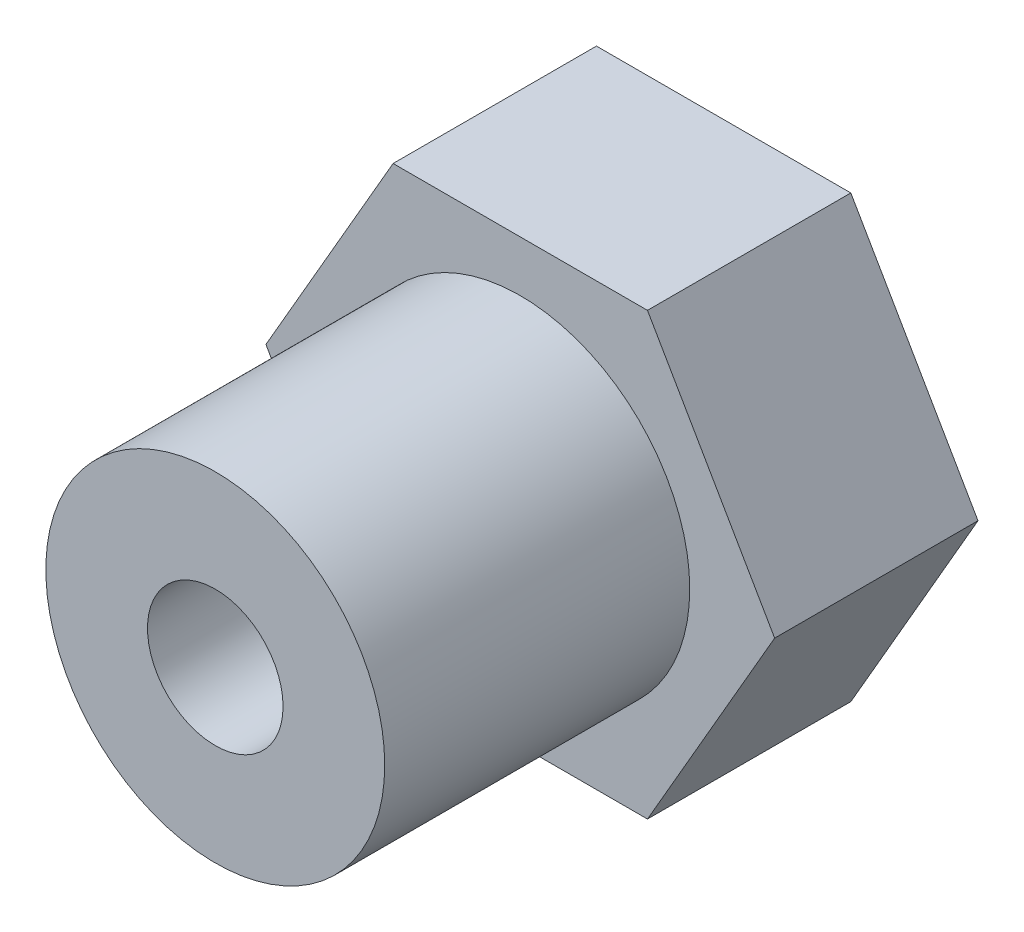
ISO-10303-21;
HEADER;
FILE_DESCRIPTION(('STEP AP214'),'2;1');
FILE_NAME('part.step','',(''),(''),'','','');
FILE_SCHEMA(('AUTOMOTIVE_DESIGN { 1 0 10303 214 1 1 1 1 }'));
ENDSEC;
DATA;
#1=APPLICATION_CONTEXT('core data for automotive mechanical design processes');
#2=APPLICATION_PROTOCOL_DEFINITION('international standard','automotive_design',2000,#1);
#3=PRODUCT_CONTEXT('',#1,'mechanical');
#4=PRODUCT('Part','Part','',(#3));
#5=PRODUCT_RELATED_PRODUCT_CATEGORY('part','',(#4));
#6=PRODUCT_DEFINITION_FORMATION('','',#4);
#7=PRODUCT_DEFINITION_CONTEXT('part definition',#1,'design');
#8=PRODUCT_DEFINITION('design','',#6,#7);
#9=PRODUCT_DEFINITION_SHAPE('','',#8);
#10=(LENGTH_UNIT() NAMED_UNIT(*) SI_UNIT(.MILLI.,.METRE.));
#11=(NAMED_UNIT(*) PLANE_ANGLE_UNIT() SI_UNIT($,.RADIAN.));
#12=(NAMED_UNIT(*) SI_UNIT($,.STERADIAN.) SOLID_ANGLE_UNIT());
#13=UNCERTAINTY_MEASURE_WITH_UNIT(LENGTH_MEASURE(1.E-05),#10,'distance_accuracy_value','');
#14=(GEOMETRIC_REPRESENTATION_CONTEXT(3) GLOBAL_UNCERTAINTY_ASSIGNED_CONTEXT((#13)) GLOBAL_UNIT_ASSIGNED_CONTEXT((#10,
#11,#12)) REPRESENTATION_CONTEXT('',''));
#15=CARTESIAN_POINT('',(0.,0.,0.));
#16=DIRECTION('',(0.,0.,1.));
#17=DIRECTION('',(1.,0.,0.));
#18=AXIS2_PLACEMENT_3D('',#15,#16,#17);
#19=CARTESIAN_POINT('',(0.,-6.5,-6.));
#20=DIRECTION('',(0.,-1.,0.));
#21=DIRECTION('',(1.,0.,0.));
#22=AXIS2_PLACEMENT_3D('',#19,#20,#21);
#23=PLANE('',#22);
#24=DIRECTION('',(1.,0.,0.));
#25=VECTOR('',#24,1.);
#26=CARTESIAN_POINT('',(0.,-6.5,0.));
#27=LINE('',#26,#25);
#28=CARTESIAN_POINT('',(-3.75277674973251,-6.50000000000004,0.));
#29=VERTEX_POINT('',#28);
#30=CARTESIAN_POINT('',(3.75277674973265,-6.49999999999996,0.));
#31=VERTEX_POINT('',#30);
#32=EDGE_CURVE('E127',#29,#31,#27,.T.);
#33=ORIENTED_EDGE('',*,*,#32,.F.);
#34=DIRECTION('',(0.,0.,1.));
#35=VECTOR('',#34,1.);
#36=CARTESIAN_POINT('',(-3.75277674973251,-6.50000000000004,-6.));
#37=LINE('',#36,#35);
#38=CARTESIAN_POINT('',(-3.75277674973251,-6.50000000000004,-6.));
#39=VERTEX_POINT('',#38);
#40=EDGE_CURVE('E45',#39,#29,#37,.T.);
#41=ORIENTED_EDGE('',*,*,#40,.F.);
#42=DIRECTION('',(1.,0.,0.));
#43=VECTOR('',#42,1.);
#44=CARTESIAN_POINT('',(0.,-6.5,-6.));
#45=LINE('',#44,#43);
#46=CARTESIAN_POINT('',(3.75277674973265,-6.49999999999996,-6.));
#47=VERTEX_POINT('',#46);
#48=EDGE_CURVE('E143',#39,#47,#45,.T.);
#49=ORIENTED_EDGE('',*,*,#48,.T.);
#50=DIRECTION('',(0.,0.,1.));
#51=VECTOR('',#50,1.);
#52=CARTESIAN_POINT('',(3.75277674973265,-6.49999999999996,-6.));
#53=LINE('',#52,#51);
#54=EDGE_CURVE('E39',#47,#31,#53,.T.);
#55=ORIENTED_EDGE('',*,*,#54,.T.);
#56=EDGE_LOOP('',(#33,#41,#49,#55));
#57=FACE_BOUND('',#56,.T.);
#58=ADVANCED_FACE('F36',(#57),#23,.T.);
#59=CARTESIAN_POINT('',(-5.62916512459883,-3.25000000000005,-6.));
#60=DIRECTION('',(-0.866025403784435,-0.500000000000007,0.));
#61=DIRECTION('',(0.500000000000007,-0.866025403784434,0.));
#62=AXIS2_PLACEMENT_3D('',#59,#60,#61);
#63=PLANE('',#62);
#64=DIRECTION('',(0.500000000000007,-0.866025403784435,0.));
#65=VECTOR('',#64,1.);
#66=CARTESIAN_POINT('',(-5.62916512459883,-3.25000000000005,0.));
#67=LINE('',#66,#65);
#68=CARTESIAN_POINT('',(-7.50555349946514,0.,0.));
#69=VERTEX_POINT('',#68);
#70=EDGE_CURVE('E140',#69,#29,#67,.T.);
#71=ORIENTED_EDGE('',*,*,#70,.F.);
#72=DIRECTION('',(0.,0.,1.));
#73=VECTOR('',#72,1.);
#74=CARTESIAN_POINT('',(-7.50555349946514,0.,-6.));
#75=LINE('',#74,#73);
#76=CARTESIAN_POINT('',(-7.50555349946514,0.,-6.));
#77=VERTEX_POINT('',#76);
#78=EDGE_CURVE('E76',#77,#69,#75,.T.);
#79=ORIENTED_EDGE('',*,*,#78,.F.);
#80=DIRECTION('',(0.500000000000007,-0.866025403784435,0.));
#81=VECTOR('',#80,1.);
#82=CARTESIAN_POINT('',(-5.62916512459883,-3.25000000000005,-6.));
#83=LINE('',#82,#81);
#84=EDGE_CURVE('E114',#77,#39,#83,.T.);
#85=ORIENTED_EDGE('',*,*,#84,.T.);
#86=ORIENTED_EDGE('',*,*,#40,.T.);
#87=EDGE_LOOP('',(#71,#79,#85,#86));
#88=FACE_BOUND('',#87,.T.);
#89=ADVANCED_FACE('F151',(#88),#63,.T.);
#90=CARTESIAN_POINT('',(-5.62916512459887,3.24999999999997,-6.));
#91=DIRECTION('',(-0.866025403784441,0.499999999999995,0.));
#92=DIRECTION('',(-0.499999999999995,-0.866025403784442,0.));
#93=AXIS2_PLACEMENT_3D('',#90,#91,#92);
#94=PLANE('',#93);
#95=DIRECTION('',(-0.499999999999995,-0.866025403784442,0.));
#96=VECTOR('',#95,1.);
#97=CARTESIAN_POINT('',(-5.62916512459887,3.24999999999997,0.));
#98=LINE('',#97,#96);
#99=CARTESIAN_POINT('',(-3.7527767497326,6.49999999999999,0.));
#100=VERTEX_POINT('',#99);
#101=EDGE_CURVE('E100',#100,#69,#98,.T.);
#102=ORIENTED_EDGE('',*,*,#101,.F.);
#103=DIRECTION('',(0.,0.,1.));
#104=VECTOR('',#103,1.);
#105=CARTESIAN_POINT('',(-3.7527767497326,6.49999999999999,-6.));
#106=LINE('',#105,#104);
#107=CARTESIAN_POINT('',(-3.7527767497326,6.49999999999999,-6.));
#108=VERTEX_POINT('',#107);
#109=EDGE_CURVE('E95',#108,#100,#106,.T.);
#110=ORIENTED_EDGE('',*,*,#109,.F.);
#111=DIRECTION('',(-0.499999999999995,-0.866025403784442,0.));
#112=VECTOR('',#111,1.);
#113=CARTESIAN_POINT('',(-5.62916512459887,3.24999999999997,-6.));
#114=LINE('',#113,#112);
#115=EDGE_CURVE('E98',#108,#77,#114,.T.);
#116=ORIENTED_EDGE('',*,*,#115,.T.);
#117=ORIENTED_EDGE('',*,*,#78,.T.);
#118=EDGE_LOOP('',(#102,#110,#116,#117));
#119=FACE_BOUND('',#118,.T.);
#120=ADVANCED_FACE('F97',(#119),#94,.T.);
#121=CARTESIAN_POINT('',(0.,6.5,-6.));
#122=DIRECTION('',(0.,1.,0.));
#123=DIRECTION('',(-1.,0.,0.));
#124=AXIS2_PLACEMENT_3D('',#121,#122,#123);
#125=PLANE('',#124);
#126=DIRECTION('',(-1.,0.,0.));
#127=VECTOR('',#126,1.);
#128=CARTESIAN_POINT('',(0.,6.5,0.));
#129=LINE('',#128,#127);
#130=CARTESIAN_POINT('',(3.75277674973256,6.50000000000001,0.));
#131=VERTEX_POINT('',#130);
#132=EDGE_CURVE('E137',#131,#100,#129,.T.);
#133=ORIENTED_EDGE('',*,*,#132,.F.);
#134=DIRECTION('',(0.,0.,1.));
#135=VECTOR('',#134,1.);
#136=CARTESIAN_POINT('',(3.75277674973256,6.50000000000001,-6.));
#137=LINE('',#136,#135);
#138=CARTESIAN_POINT('',(3.75277674973256,6.50000000000001,-6.));
#139=VERTEX_POINT('',#138);
#140=EDGE_CURVE('E105',#139,#131,#137,.T.);
#141=ORIENTED_EDGE('',*,*,#140,.F.);
#142=DIRECTION('',(-1.,0.,0.));
#143=VECTOR('',#142,1.);
#144=CARTESIAN_POINT('',(0.,6.5,-6.));
#145=LINE('',#144,#143);
#146=EDGE_CURVE('E112',#139,#108,#145,.T.);
#147=ORIENTED_EDGE('',*,*,#146,.T.);
#148=ORIENTED_EDGE('',*,*,#109,.T.);
#149=EDGE_LOOP('',(#133,#141,#147,#148));
#150=FACE_BOUND('',#149,.T.);
#151=ADVANCED_FACE('F116',(#150),#125,.T.);
#152=CARTESIAN_POINT('',(5.62916512459885,3.25000000000001,-6.));
#153=DIRECTION('',(0.866025403784438,0.500000000000001,0.));
#154=DIRECTION('',(-0.500000000000001,0.866025403784438,0.));
#155=AXIS2_PLACEMENT_3D('',#152,#153,#154);
#156=PLANE('',#155);
#157=DIRECTION('',(-0.500000000000001,0.866025403784438,0.));
#158=VECTOR('',#157,1.);
#159=CARTESIAN_POINT('',(5.62916512459885,3.25000000000001,0.));
#160=LINE('',#159,#158);
#161=CARTESIAN_POINT('',(7.50555349946514,0.,0.));
#162=VERTEX_POINT('',#161);
#163=EDGE_CURVE('E134',#162,#131,#160,.T.);
#164=ORIENTED_EDGE('',*,*,#163,.F.);
#165=DIRECTION('',(0.,0.,1.));
#166=VECTOR('',#165,1.);
#167=CARTESIAN_POINT('',(7.50555349946514,0.,-6.));
#168=LINE('',#167,#166);
#169=CARTESIAN_POINT('',(7.50555349946514,0.,-6.));
#170=VERTEX_POINT('',#169);
#171=EDGE_CURVE('E146',#170,#162,#168,.T.);
#172=ORIENTED_EDGE('',*,*,#171,.F.);
#173=DIRECTION('',(-0.500000000000001,0.866025403784438,0.));
#174=VECTOR('',#173,1.);
#175=CARTESIAN_POINT('',(5.62916512459885,3.25000000000001,-6.));
#176=LINE('',#175,#174);
#177=EDGE_CURVE('E117',#170,#139,#176,.T.);
#178=ORIENTED_EDGE('',*,*,#177,.T.);
#179=ORIENTED_EDGE('',*,*,#140,.T.);
#180=EDGE_LOOP('',(#164,#172,#178,#179));
#181=FACE_BOUND('',#180,.T.);
#182=ADVANCED_FACE('F165',(#181),#156,.T.);
#183=CARTESIAN_POINT('',(5.62916512459889,-3.24999999999998,-6.));
#184=DIRECTION('',(0.866025403784441,-0.499999999999995,0.));
#185=DIRECTION('',(0.499999999999995,0.866025403784442,0.));
#186=AXIS2_PLACEMENT_3D('',#183,#184,#185);
#187=PLANE('',#186);
#188=DIRECTION('',(0.499999999999995,0.866025403784442,0.));
#189=VECTOR('',#188,1.);
#190=CARTESIAN_POINT('',(5.62916512459889,-3.24999999999998,0.));
#191=LINE('',#190,#189);
#192=EDGE_CURVE('E130',#31,#162,#191,.T.);
#193=ORIENTED_EDGE('',*,*,#192,.F.);
#194=ORIENTED_EDGE('',*,*,#54,.F.);
#195=DIRECTION('',(0.499999999999995,0.866025403784442,0.));
#196=VECTOR('',#195,1.);
#197=CARTESIAN_POINT('',(5.62916512459889,-3.24999999999998,-6.));
#198=LINE('',#197,#196);
#199=EDGE_CURVE('E119',#47,#170,#198,.T.);
#200=ORIENTED_EDGE('',*,*,#199,.T.);
#201=ORIENTED_EDGE('',*,*,#171,.T.);
#202=EDGE_LOOP('',(#193,#194,#200,#201));
#203=FACE_BOUND('',#202,.T.);
#204=ADVANCED_FACE('F148',(#203),#187,.T.);
#205=CARTESIAN_POINT('',(0.,0.,-6.));
#206=DIRECTION('',(0.,0.,1.));
#207=DIRECTION('',(1.,0.,0.));
#208=AXIS2_PLACEMENT_3D('',#205,#206,#207);
#209=CYLINDRICAL_SURFACE('',#208,2.);
#210=CARTESIAN_POINT('',(0.,0.,-6.));
#211=DIRECTION('',(0.,0.,1.));
#212=DIRECTION('',(1.,0.,0.));
#213=AXIS2_PLACEMENT_3D('',#210,#211,#212);
#214=CIRCLE('',#213,2.);
#215=CARTESIAN_POINT('',(2.,0.,-6.));
#216=VERTEX_POINT('',#215);
#217=EDGE_CURVE('E124',#216,#216,#214,.T.);
#218=ORIENTED_EDGE('',*,*,#217,.F.);
#219=EDGE_LOOP('',(#218));
#220=FACE_BOUND('',#219,.T.);
#221=CARTESIAN_POINT('',(0.,0.,9.));
#222=DIRECTION('',(0.,0.,1.));
#223=DIRECTION('',(1.,0.,0.));
#224=AXIS2_PLACEMENT_3D('',#221,#222,#223);
#225=CIRCLE('',#224,2.);
#226=CARTESIAN_POINT('',(2.,0.,9.));
#227=VERTEX_POINT('',#226);
#228=EDGE_CURVE('E181',#227,#227,#225,.T.);
#229=ORIENTED_EDGE('',*,*,#228,.T.);
#230=EDGE_LOOP('',(#229));
#231=FACE_BOUND('',#230,.T.);
#232=ADVANCED_FACE('F160',(#220,#231),#209,.F.);
#233=CARTESIAN_POINT('',(0.,0.,-6.));
#234=DIRECTION('',(0.,0.,1.));
#235=DIRECTION('',(1.,0.,0.));
#236=AXIS2_PLACEMENT_3D('',#233,#234,#235);
#237=PLANE('',#236);
#238=ORIENTED_EDGE('',*,*,#48,.F.);
#239=ORIENTED_EDGE('',*,*,#84,.F.);
#240=ORIENTED_EDGE('',*,*,#115,.F.);
#241=ORIENTED_EDGE('',*,*,#146,.F.);
#242=ORIENTED_EDGE('',*,*,#177,.F.);
#243=ORIENTED_EDGE('',*,*,#199,.F.);
#244=EDGE_LOOP('',(#238,#239,#240,#241,#242,#243));
#245=FACE_BOUND('',#244,.T.);
#246=ORIENTED_EDGE('',*,*,#217,.T.);
#247=EDGE_LOOP('',(#246));
#248=FACE_BOUND('',#247,.T.);
#249=ADVANCED_FACE('F109',(#245,#248),#237,.F.);
#250=CARTESIAN_POINT('',(0.,0.,0.));
#251=DIRECTION('',(0.,0.,1.));
#252=DIRECTION('',(1.,0.,0.));
#253=AXIS2_PLACEMENT_3D('',#250,#251,#252);
#254=PLANE('',#253);
#255=CARTESIAN_POINT('',(0.,0.,0.));
#256=DIRECTION('',(0.,0.,1.));
#257=DIRECTION('',(1.,0.,0.));
#258=AXIS2_PLACEMENT_3D('',#255,#256,#257);
#259=CIRCLE('',#258,5.);
#260=CARTESIAN_POINT('',(5.,0.,0.));
#261=VERTEX_POINT('',#260);
#262=EDGE_CURVE('E11',#261,#261,#259,.T.);
#263=ORIENTED_EDGE('',*,*,#262,.F.);
#264=EDGE_LOOP('',(#263));
#265=FACE_BOUND('',#264,.T.);
#266=ORIENTED_EDGE('',*,*,#32,.T.);
#267=ORIENTED_EDGE('',*,*,#192,.T.);
#268=ORIENTED_EDGE('',*,*,#163,.T.);
#269=ORIENTED_EDGE('',*,*,#132,.T.);
#270=ORIENTED_EDGE('',*,*,#101,.T.);
#271=ORIENTED_EDGE('',*,*,#70,.T.);
#272=EDGE_LOOP('',(#266,#267,#268,#269,#270,#271));
#273=FACE_BOUND('',#272,.T.);
#274=ADVANCED_FACE('F150',(#265,#273),#254,.T.);
#275=CARTESIAN_POINT('',(0.,0.,9.));
#276=DIRECTION('',(0.,0.,-1.));
#277=DIRECTION('',(-1.,0.,0.));
#278=AXIS2_PLACEMENT_3D('',#275,#276,#277);
#279=CYLINDRICAL_SURFACE('',#278,5.);
#280=CARTESIAN_POINT('',(0.,0.,9.));
#281=DIRECTION('',(0.,0.,1.));
#282=DIRECTION('',(1.,0.,0.));
#283=AXIS2_PLACEMENT_3D('',#280,#281,#282);
#284=CIRCLE('',#283,5.);
#285=CARTESIAN_POINT('',(5.,0.,9.));
#286=VERTEX_POINT('',#285);
#287=EDGE_CURVE('E131',#286,#286,#284,.T.);
#288=ORIENTED_EDGE('',*,*,#287,.F.);
#289=EDGE_LOOP('',(#288));
#290=FACE_BOUND('',#289,.T.);
#291=ORIENTED_EDGE('',*,*,#262,.T.);
#292=EDGE_LOOP('',(#291));
#293=FACE_BOUND('',#292,.T.);
#294=ADVANCED_FACE('F191',(#290,#293),#279,.T.);
#295=CARTESIAN_POINT('',(0.,0.,9.));
#296=DIRECTION('',(0.,0.,1.));
#297=DIRECTION('',(1.,0.,0.));
#298=AXIS2_PLACEMENT_3D('',#295,#296,#297);
#299=PLANE('',#298);
#300=ORIENTED_EDGE('',*,*,#228,.F.);
#301=EDGE_LOOP('',(#300));
#302=FACE_BOUND('',#301,.T.);
#303=ORIENTED_EDGE('',*,*,#287,.T.);
#304=EDGE_LOOP('',(#303));
#305=FACE_BOUND('',#304,.T.);
#306=ADVANCED_FACE('F189',(#302,#305),#299,.T.);
#307=CLOSED_SHELL('',(#58,#89,#120,#151,#182,#204,#232,#249,#274,#294,#306));
#308=MANIFOLD_SOLID_BREP('B2',#307);
#309=ADVANCED_BREP_SHAPE_REPRESENTATION('',(#18,#308),#14);
#310=SHAPE_DEFINITION_REPRESENTATION(#9,#309);
ENDSEC;
END-ISO-10303-21;
